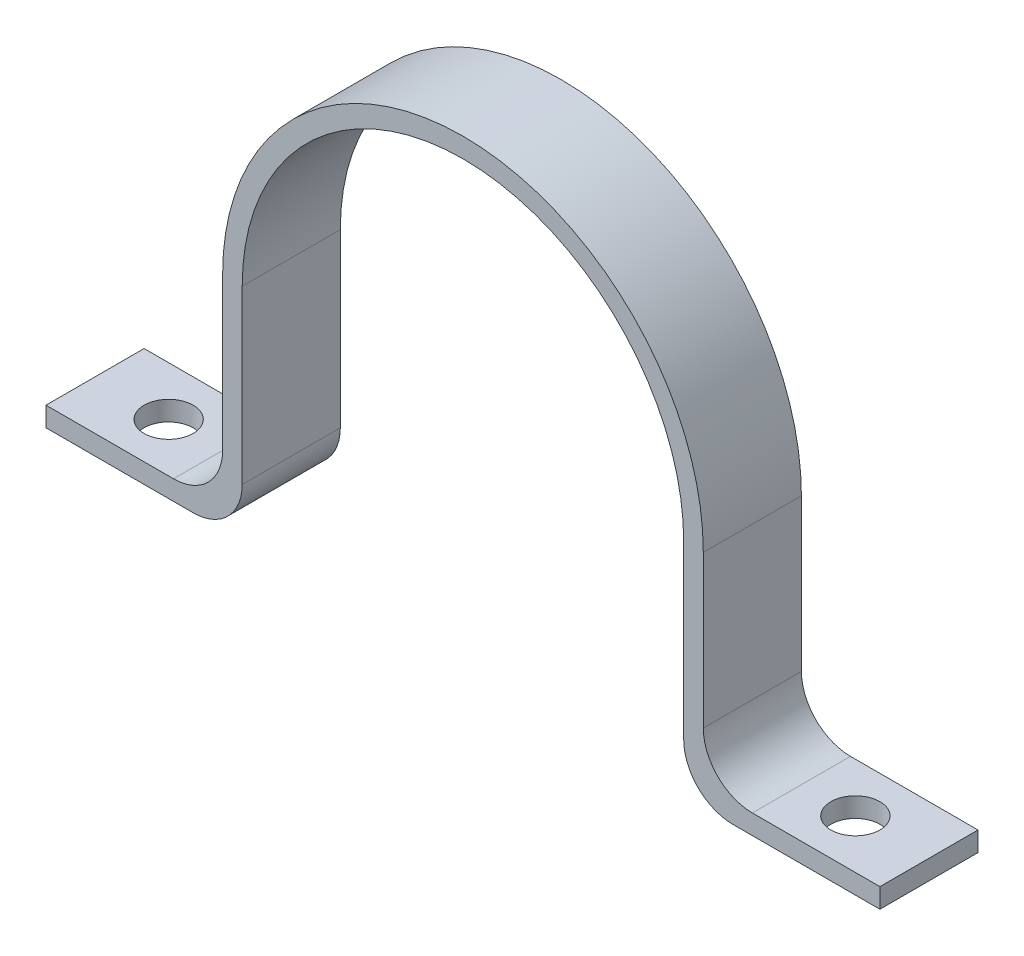
ISO-10303-21;
HEADER;
FILE_DESCRIPTION(('STEP AP214'),'2;1');
FILE_NAME('part.step','',(''),(''),'','','');
FILE_SCHEMA(('AUTOMOTIVE_DESIGN { 1 0 10303 214 1 1 1 1 }'));
ENDSEC;
DATA;
#1=APPLICATION_CONTEXT('core data for automotive mechanical design processes');
#2=APPLICATION_PROTOCOL_DEFINITION('international standard','automotive_design',2000,#1);
#3=PRODUCT_CONTEXT('',#1,'mechanical');
#4=PRODUCT('Part','Part','',(#3));
#5=PRODUCT_RELATED_PRODUCT_CATEGORY('part','',(#4));
#6=PRODUCT_DEFINITION_FORMATION('','',#4);
#7=PRODUCT_DEFINITION_CONTEXT('part definition',#1,'design');
#8=PRODUCT_DEFINITION('design','',#6,#7);
#9=PRODUCT_DEFINITION_SHAPE('','',#8);
#10=(LENGTH_UNIT() NAMED_UNIT(*) SI_UNIT(.MILLI.,.METRE.));
#11=(NAMED_UNIT(*) PLANE_ANGLE_UNIT() SI_UNIT($,.RADIAN.));
#12=(NAMED_UNIT(*) SI_UNIT($,.STERADIAN.) SOLID_ANGLE_UNIT());
#13=UNCERTAINTY_MEASURE_WITH_UNIT(LENGTH_MEASURE(1.E-05),#10,'distance_accuracy_value','');
#14=(GEOMETRIC_REPRESENTATION_CONTEXT(3) GLOBAL_UNCERTAINTY_ASSIGNED_CONTEXT((#13)) GLOBAL_UNIT_ASSIGNED_CONTEXT((#10,
#11,#12)) REPRESENTATION_CONTEXT('',''));
#15=CARTESIAN_POINT('',(0.,0.,0.));
#16=DIRECTION('',(0.,0.,1.));
#17=DIRECTION('',(1.,0.,0.));
#18=AXIS2_PLACEMENT_3D('',#15,#16,#17);
#19=CARTESIAN_POINT('',(24.5,0.,10.));
#20=DIRECTION('',(-1.,0.,0.));
#21=DIRECTION('',(0.,-1.,0.));
#22=AXIS2_PLACEMENT_3D('',#19,#20,#21);
#23=PLANE('',#22);
#24=DIRECTION('',(0.,1.,0.));
#25=VECTOR('',#24,1.);
#26=CARTESIAN_POINT('',(24.5,0.,10.));
#27=LINE('',#26,#25);
#28=CARTESIAN_POINT('',(24.5,-15.5,10.));
#29=VERTEX_POINT('',#28);
#30=CARTESIAN_POINT('',(24.5,0.,10.));
#31=VERTEX_POINT('',#30);
#32=EDGE_CURVE('E199',#29,#31,#27,.T.);
#33=ORIENTED_EDGE('',*,*,#32,.F.);
#34=DIRECTION('',(0.,0.,-1.));
#35=VECTOR('',#34,1.);
#36=CARTESIAN_POINT('',(24.5,-15.5,0.));
#37=LINE('',#36,#35);
#38=CARTESIAN_POINT('',(24.5,-15.5,0.));
#39=VERTEX_POINT('',#38);
#40=EDGE_CURVE('E265',#29,#39,#37,.T.);
#41=ORIENTED_EDGE('',*,*,#40,.T.);
#42=DIRECTION('',(0.,1.,0.));
#43=VECTOR('',#42,1.);
#44=CARTESIAN_POINT('',(24.5,0.,0.));
#45=LINE('',#44,#43);
#46=CARTESIAN_POINT('',(24.5,0.,0.));
#47=VERTEX_POINT('',#46);
#48=EDGE_CURVE('E198',#39,#47,#45,.T.);
#49=ORIENTED_EDGE('',*,*,#48,.T.);
#50=DIRECTION('',(0.,0.,-1.));
#51=VECTOR('',#50,1.);
#52=CARTESIAN_POINT('',(24.5,0.,10.));
#53=LINE('',#52,#51);
#54=EDGE_CURVE('E246',#31,#47,#53,.T.);
#55=ORIENTED_EDGE('',*,*,#54,.F.);
#56=EDGE_LOOP('',(#33,#41,#49,#55));
#57=FACE_BOUND('',#56,.T.);
#58=ADVANCED_FACE('F34',(#57),#23,.F.);
#59=CARTESIAN_POINT('',(0.,0.,10.));
#60=DIRECTION('',(0.,0.,-1.));
#61=DIRECTION('',(-1.,0.,0.));
#62=AXIS2_PLACEMENT_3D('',#59,#60,#61);
#63=CYLINDRICAL_SURFACE('',#62,24.5);
#64=CARTESIAN_POINT('',(0.,0.,0.));
#65=DIRECTION('',(0.,0.,1.));
#66=DIRECTION('',(1.,0.,0.));
#67=AXIS2_PLACEMENT_3D('',#64,#65,#66);
#68=CIRCLE('',#67,24.5);
#69=CARTESIAN_POINT('',(-24.5,0.,0.));
#70=VERTEX_POINT('',#69);
#71=EDGE_CURVE('E219',#47,#70,#68,.T.);
#72=ORIENTED_EDGE('',*,*,#71,.T.);
#73=DIRECTION('',(0.,0.,-1.));
#74=VECTOR('',#73,1.);
#75=CARTESIAN_POINT('',(-24.5,0.,10.));
#76=LINE('',#75,#74);
#77=CARTESIAN_POINT('',(-24.5,0.,10.));
#78=VERTEX_POINT('',#77);
#79=EDGE_CURVE('E243',#78,#70,#76,.T.);
#80=ORIENTED_EDGE('',*,*,#79,.F.);
#81=CARTESIAN_POINT('',(0.,0.,10.));
#82=DIRECTION('',(0.,0.,1.));
#83=DIRECTION('',(1.,0.,0.));
#84=AXIS2_PLACEMENT_3D('',#81,#82,#83);
#85=CIRCLE('',#84,24.5);
#86=EDGE_CURVE('E201',#31,#78,#85,.T.);
#87=ORIENTED_EDGE('',*,*,#86,.F.);
#88=ORIENTED_EDGE('',*,*,#54,.T.);
#89=EDGE_LOOP('',(#72,#80,#87,#88));
#90=FACE_BOUND('',#89,.T.);
#91=ADVANCED_FACE('F295',(#90),#63,.T.);
#92=CARTESIAN_POINT('',(-24.5,0.,10.));
#93=DIRECTION('',(1.,0.,0.));
#94=DIRECTION('',(0.,0.,-1.));
#95=AXIS2_PLACEMENT_3D('',#92,#93,#94);
#96=PLANE('',#95);
#97=DIRECTION('',(0.,-1.,0.));
#98=VECTOR('',#97,1.);
#99=CARTESIAN_POINT('',(-24.5,0.,0.));
#100=LINE('',#99,#98);
#101=CARTESIAN_POINT('',(-24.5,-15.5,0.));
#102=VERTEX_POINT('',#101);
#103=EDGE_CURVE('E221',#70,#102,#100,.T.);
#104=ORIENTED_EDGE('',*,*,#103,.T.);
#105=DIRECTION('',(0.,0.,-1.));
#106=VECTOR('',#105,1.);
#107=CARTESIAN_POINT('',(-24.5,-15.5,10.));
#108=LINE('',#107,#106);
#109=CARTESIAN_POINT('',(-24.5,-15.5,10.));
#110=VERTEX_POINT('',#109);
#111=EDGE_CURVE('E260',#102,#110,#108,.F.);
#112=ORIENTED_EDGE('',*,*,#111,.T.);
#113=DIRECTION('',(0.,-1.,0.));
#114=VECTOR('',#113,1.);
#115=CARTESIAN_POINT('',(-24.5,0.,10.));
#116=LINE('',#115,#114);
#117=EDGE_CURVE('E162',#78,#110,#116,.T.);
#118=ORIENTED_EDGE('',*,*,#117,.F.);
#119=ORIENTED_EDGE('',*,*,#79,.T.);
#120=EDGE_LOOP('',(#104,#112,#118,#119));
#121=FACE_BOUND('',#120,.T.);
#122=ADVANCED_FACE('F344',(#121),#96,.F.);
#123=CARTESIAN_POINT('',(-32.5,-20.5,10.));
#124=DIRECTION('',(0.,-1.,0.));
#125=DIRECTION('',(1.,0.,0.));
#126=AXIS2_PLACEMENT_3D('',#123,#124,#125);
#127=PLANE('',#126);
#128=CARTESIAN_POINT('',(-35.,-20.5,5.));
#129=DIRECTION('',(0.,1.,0.));
#130=DIRECTION('',(-1.,0.,0.));
#131=AXIS2_PLACEMENT_3D('',#128,#129,#130);
#132=CIRCLE('',#131,2.49999999999999);
#133=CARTESIAN_POINT('',(-37.5,-20.5,5.));
#134=VERTEX_POINT('',#133);
#135=EDGE_CURVE('E180',#134,#134,#132,.T.);
#136=ORIENTED_EDGE('',*,*,#135,.F.);
#137=EDGE_LOOP('',(#136));
#138=FACE_BOUND('',#137,.T.);
#139=DIRECTION('',(-1.,0.,0.));
#140=VECTOR('',#139,1.);
#141=CARTESIAN_POINT('',(-32.5,-20.5,10.));
#142=LINE('',#141,#140);
#143=CARTESIAN_POINT('',(-29.5,-20.5,10.));
#144=VERTEX_POINT('',#143);
#145=CARTESIAN_POINT('',(-42.5,-20.5,10.));
#146=VERTEX_POINT('',#145);
#147=EDGE_CURVE('E149',#144,#146,#142,.T.);
#148=ORIENTED_EDGE('',*,*,#147,.F.);
#149=DIRECTION('',(0.,0.,-1.));
#150=VECTOR('',#149,1.);
#151=CARTESIAN_POINT('',(-29.5,-20.5,0.));
#152=LINE('',#151,#150);
#153=CARTESIAN_POINT('',(-29.5,-20.5,0.));
#154=VERTEX_POINT('',#153);
#155=EDGE_CURVE('E258',#144,#154,#152,.T.);
#156=ORIENTED_EDGE('',*,*,#155,.T.);
#157=DIRECTION('',(-1.,0.,0.));
#158=VECTOR('',#157,1.);
#159=CARTESIAN_POINT('',(-32.5,-20.5,0.));
#160=LINE('',#159,#158);
#161=CARTESIAN_POINT('',(-42.5,-20.5,0.));
#162=VERTEX_POINT('',#161);
#163=EDGE_CURVE('E168',#154,#162,#160,.T.);
#164=ORIENTED_EDGE('',*,*,#163,.T.);
#165=DIRECTION('',(0.,0.,-1.));
#166=VECTOR('',#165,1.);
#167=CARTESIAN_POINT('',(-42.5,-20.5,10.));
#168=LINE('',#167,#166);
#169=EDGE_CURVE('E165',#146,#162,#168,.T.);
#170=ORIENTED_EDGE('',*,*,#169,.F.);
#171=EDGE_LOOP('',(#148,#156,#164,#170));
#172=FACE_BOUND('',#171,.T.);
#173=ADVANCED_FACE('F166',(#138,#172),#127,.F.);
#174=CARTESIAN_POINT('',(-22.5,-22.5,10.));
#175=DIRECTION('',(0.,1.,0.));
#176=DIRECTION('',(-1.,0.,0.));
#177=AXIS2_PLACEMENT_3D('',#174,#175,#176);
#178=PLANE('',#177);
#179=CARTESIAN_POINT('',(-35.,-22.5,5.));
#180=DIRECTION('',(0.,1.,0.));
#181=DIRECTION('',(-1.,0.,0.));
#182=AXIS2_PLACEMENT_3D('',#179,#180,#181);
#183=CIRCLE('',#182,2.49999999999999);
#184=CARTESIAN_POINT('',(-37.5,-22.5,5.));
#185=VERTEX_POINT('',#184);
#186=EDGE_CURVE('E38',#185,#185,#183,.T.);
#187=ORIENTED_EDGE('',*,*,#186,.T.);
#188=EDGE_LOOP('',(#187));
#189=FACE_BOUND('',#188,.T.);
#190=DIRECTION('',(1.,0.,0.));
#191=VECTOR('',#190,1.);
#192=CARTESIAN_POINT('',(-22.5,-22.5,0.));
#193=LINE('',#192,#191);
#194=CARTESIAN_POINT('',(-42.5,-22.5,0.));
#195=VERTEX_POINT('',#194);
#196=CARTESIAN_POINT('',(-27.5,-22.5,0.));
#197=VERTEX_POINT('',#196);
#198=EDGE_CURVE('E225',#195,#197,#193,.T.);
#199=ORIENTED_EDGE('',*,*,#198,.T.);
#200=DIRECTION('',(0.,0.,-1.));
#201=VECTOR('',#200,1.);
#202=CARTESIAN_POINT('',(-27.5,-22.5,10.));
#203=LINE('',#202,#201);
#204=CARTESIAN_POINT('',(-27.5,-22.5,10.));
#205=VERTEX_POINT('',#204);
#206=EDGE_CURVE('E254',#197,#205,#203,.F.);
#207=ORIENTED_EDGE('',*,*,#206,.T.);
#208=DIRECTION('',(1.,0.,0.));
#209=VECTOR('',#208,1.);
#210=CARTESIAN_POINT('',(-22.5,-22.5,10.));
#211=LINE('',#210,#209);
#212=CARTESIAN_POINT('',(-42.5,-22.5,10.));
#213=VERTEX_POINT('',#212);
#214=EDGE_CURVE('E161',#213,#205,#211,.T.);
#215=ORIENTED_EDGE('',*,*,#214,.F.);
#216=DIRECTION('',(0.,0.,1.));
#217=VECTOR('',#216,1.);
#218=CARTESIAN_POINT('',(-42.5,-22.5,10.));
#219=LINE('',#218,#217);
#220=EDGE_CURVE('E177',#195,#213,#219,.T.);
#221=ORIENTED_EDGE('',*,*,#220,.F.);
#222=EDGE_LOOP('',(#199,#207,#215,#221));
#223=FACE_BOUND('',#222,.T.);
#224=ADVANCED_FACE('F304',(#189,#223),#178,.F.);
#225=CARTESIAN_POINT('',(-22.5,0.,10.));
#226=DIRECTION('',(-1.,0.,0.));
#227=DIRECTION('',(0.,-1.,0.));
#228=AXIS2_PLACEMENT_3D('',#225,#226,#227);
#229=PLANE('',#228);
#230=DIRECTION('',(0.,1.,0.));
#231=VECTOR('',#230,1.);
#232=CARTESIAN_POINT('',(-22.5,0.,10.));
#233=LINE('',#232,#231);
#234=CARTESIAN_POINT('',(-22.5,-17.5,10.));
#235=VERTEX_POINT('',#234);
#236=CARTESIAN_POINT('',(-22.5,0.,10.));
#237=VERTEX_POINT('',#236);
#238=EDGE_CURVE('E206',#235,#237,#233,.T.);
#239=ORIENTED_EDGE('',*,*,#238,.F.);
#240=DIRECTION('',(0.,0.,-1.));
#241=VECTOR('',#240,1.);
#242=CARTESIAN_POINT('',(-22.5,-17.5,10.));
#243=LINE('',#242,#241);
#244=CARTESIAN_POINT('',(-22.5,-17.5,0.));
#245=VERTEX_POINT('',#244);
#246=EDGE_CURVE('E249',#235,#245,#243,.T.);
#247=ORIENTED_EDGE('',*,*,#246,.T.);
#248=DIRECTION('',(0.,1.,0.));
#249=VECTOR('',#248,1.);
#250=CARTESIAN_POINT('',(-22.5,0.,0.));
#251=LINE('',#250,#249);
#252=CARTESIAN_POINT('',(-22.5,0.,0.));
#253=VERTEX_POINT('',#252);
#254=EDGE_CURVE('E228',#245,#253,#251,.T.);
#255=ORIENTED_EDGE('',*,*,#254,.T.);
#256=DIRECTION('',(0.,0.,-1.));
#257=VECTOR('',#256,1.);
#258=CARTESIAN_POINT('',(-22.5,0.,10.));
#259=LINE('',#258,#257);
#260=EDGE_CURVE('E240',#237,#253,#259,.T.);
#261=ORIENTED_EDGE('',*,*,#260,.F.);
#262=EDGE_LOOP('',(#239,#247,#255,#261));
#263=FACE_BOUND('',#262,.T.);
#264=ADVANCED_FACE('F313',(#263),#229,.F.);
#265=CARTESIAN_POINT('',(0.,0.,10.));
#266=DIRECTION('',(0.,0.,-1.));
#267=DIRECTION('',(-1.,0.,0.));
#268=AXIS2_PLACEMENT_3D('',#265,#266,#267);
#269=CYLINDRICAL_SURFACE('',#268,22.5);
#270=CARTESIAN_POINT('',(0.,0.,0.));
#271=DIRECTION('',(0.,0.,-1.));
#272=DIRECTION('',(1.,0.,0.));
#273=AXIS2_PLACEMENT_3D('',#270,#271,#272);
#274=CIRCLE('',#273,22.5);
#275=CARTESIAN_POINT('',(22.5,0.,0.));
#276=VERTEX_POINT('',#275);
#277=EDGE_CURVE('E230',#253,#276,#274,.T.);
#278=ORIENTED_EDGE('',*,*,#277,.T.);
#279=DIRECTION('',(0.,0.,-1.));
#280=VECTOR('',#279,1.);
#281=CARTESIAN_POINT('',(22.5,0.,10.));
#282=LINE('',#281,#280);
#283=CARTESIAN_POINT('',(22.5,0.,10.));
#284=VERTEX_POINT('',#283);
#285=EDGE_CURVE('E217',#284,#276,#282,.T.);
#286=ORIENTED_EDGE('',*,*,#285,.F.);
#287=CARTESIAN_POINT('',(0.,0.,10.));
#288=DIRECTION('',(0.,0.,-1.));
#289=DIRECTION('',(1.,0.,0.));
#290=AXIS2_PLACEMENT_3D('',#287,#288,#289);
#291=CIRCLE('',#290,22.5);
#292=EDGE_CURVE('E208',#237,#284,#291,.T.);
#293=ORIENTED_EDGE('',*,*,#292,.F.);
#294=ORIENTED_EDGE('',*,*,#260,.T.);
#295=EDGE_LOOP('',(#278,#286,#293,#294));
#296=FACE_BOUND('',#295,.T.);
#297=ADVANCED_FACE('F318',(#296),#269,.F.);
#298=CARTESIAN_POINT('',(22.5,0.,10.));
#299=DIRECTION('',(1.,0.,0.));
#300=DIRECTION('',(0.,1.,0.));
#301=AXIS2_PLACEMENT_3D('',#298,#299,#300);
#302=PLANE('',#301);
#303=DIRECTION('',(0.,-1.,0.));
#304=VECTOR('',#303,1.);
#305=CARTESIAN_POINT('',(22.5,0.,0.));
#306=LINE('',#305,#304);
#307=CARTESIAN_POINT('',(22.5,-17.5,0.));
#308=VERTEX_POINT('',#307);
#309=EDGE_CURVE('E232',#276,#308,#306,.T.);
#310=ORIENTED_EDGE('',*,*,#309,.T.);
#311=DIRECTION('',(0.,0.,-1.));
#312=VECTOR('',#311,1.);
#313=CARTESIAN_POINT('',(22.5,-17.5,10.));
#314=LINE('',#313,#312);
#315=CARTESIAN_POINT('',(22.5,-17.5,10.));
#316=VERTEX_POINT('',#315);
#317=EDGE_CURVE('E50',#308,#316,#314,.F.);
#318=ORIENTED_EDGE('',*,*,#317,.T.);
#319=DIRECTION('',(0.,-1.,0.));
#320=VECTOR('',#319,1.);
#321=CARTESIAN_POINT('',(22.5,0.,10.));
#322=LINE('',#321,#320);
#323=EDGE_CURVE('E210',#284,#316,#322,.T.);
#324=ORIENTED_EDGE('',*,*,#323,.F.);
#325=ORIENTED_EDGE('',*,*,#285,.T.);
#326=EDGE_LOOP('',(#310,#318,#324,#325));
#327=FACE_BOUND('',#326,.T.);
#328=ADVANCED_FACE('F320',(#327),#302,.F.);
#329=CARTESIAN_POINT('',(22.5,-22.5,10.));
#330=DIRECTION('',(0.,1.,0.));
#331=DIRECTION('',(0.,0.,1.));
#332=AXIS2_PLACEMENT_3D('',#329,#330,#331);
#333=PLANE('',#332);
#334=CARTESIAN_POINT('',(35.,-22.5,5.));
#335=DIRECTION('',(0.,1.,0.));
#336=DIRECTION('',(0.,0.,1.));
#337=AXIS2_PLACEMENT_3D('',#334,#335,#336);
#338=CIRCLE('',#337,2.49999999999999);
#339=CARTESIAN_POINT('',(35.,-22.5,7.49999999999999));
#340=VERTEX_POINT('',#339);
#341=EDGE_CURVE('E460',#340,#340,#338,.F.);
#342=ORIENTED_EDGE('',*,*,#341,.F.);
#343=EDGE_LOOP('',(#342));
#344=FACE_BOUND('',#343,.T.);
#345=DIRECTION('',(1.,0.,0.));
#346=VECTOR('',#345,1.);
#347=CARTESIAN_POINT('',(22.5,-22.5,10.));
#348=LINE('',#347,#346);
#349=CARTESIAN_POINT('',(27.5,-22.5,10.));
#350=VERTEX_POINT('',#349);
#351=CARTESIAN_POINT('',(42.5000000000001,-22.5,10.));
#352=VERTEX_POINT('',#351);
#353=EDGE_CURVE('E212',#350,#352,#348,.T.);
#354=ORIENTED_EDGE('',*,*,#353,.F.);
#355=DIRECTION('',(0.,0.,-1.));
#356=VECTOR('',#355,1.);
#357=CARTESIAN_POINT('',(27.5,-22.5,10.));
#358=LINE('',#357,#356);
#359=CARTESIAN_POINT('',(27.5,-22.5,0.));
#360=VERTEX_POINT('',#359);
#361=EDGE_CURVE('E270',#350,#360,#358,.T.);
#362=ORIENTED_EDGE('',*,*,#361,.T.);
#363=DIRECTION('',(1.,0.,0.));
#364=VECTOR('',#363,1.);
#365=CARTESIAN_POINT('',(22.5,-22.5,0.));
#366=LINE('',#365,#364);
#367=CARTESIAN_POINT('',(42.5000000000001,-22.5,0.));
#368=VERTEX_POINT('',#367);
#369=EDGE_CURVE('E234',#360,#368,#366,.T.);
#370=ORIENTED_EDGE('',*,*,#369,.T.);
#371=DIRECTION('',(0.,0.,-1.));
#372=VECTOR('',#371,1.);
#373=CARTESIAN_POINT('',(42.5000000000001,-22.5,10.));
#374=LINE('',#373,#372);
#375=EDGE_CURVE('E189',#352,#368,#374,.T.);
#376=ORIENTED_EDGE('',*,*,#375,.F.);
#377=EDGE_LOOP('',(#354,#362,#370,#376));
#378=FACE_BOUND('',#377,.T.);
#379=ADVANCED_FACE('F326',(#344,#378),#333,.F.);
#380=CARTESIAN_POINT('',(24.5,-20.5,10.));
#381=DIRECTION('',(0.,-1.,0.));
#382=DIRECTION('',(0.,0.,-1.));
#383=AXIS2_PLACEMENT_3D('',#380,#381,#382);
#384=PLANE('',#383);
#385=CARTESIAN_POINT('',(35.,-20.5,5.));
#386=DIRECTION('',(0.,-1.,0.));
#387=DIRECTION('',(1.,0.,0.));
#388=AXIS2_PLACEMENT_3D('',#385,#386,#387);
#389=CIRCLE('',#388,2.49999999999999);
#390=CARTESIAN_POINT('',(37.5,-20.5,5.));
#391=VERTEX_POINT('',#390);
#392=EDGE_CURVE('E457',#391,#391,#389,.T.);
#393=ORIENTED_EDGE('',*,*,#392,.T.);
#394=EDGE_LOOP('',(#393));
#395=FACE_BOUND('',#394,.T.);
#396=DIRECTION('',(-1.,0.,0.));
#397=VECTOR('',#396,1.);
#398=CARTESIAN_POINT('',(24.5,-20.5,0.));
#399=LINE('',#398,#397);
#400=CARTESIAN_POINT('',(42.5000000000001,-20.5,0.));
#401=VERTEX_POINT('',#400);
#402=CARTESIAN_POINT('',(29.5,-20.5,0.));
#403=VERTEX_POINT('',#402);
#404=EDGE_CURVE('E202',#401,#403,#399,.T.);
#405=ORIENTED_EDGE('',*,*,#404,.T.);
#406=DIRECTION('',(0.,0.,-1.));
#407=VECTOR('',#406,1.);
#408=CARTESIAN_POINT('',(29.5,-20.5,10.));
#409=LINE('',#408,#407);
#410=CARTESIAN_POINT('',(29.5,-20.5,10.));
#411=VERTEX_POINT('',#410);
#412=EDGE_CURVE('E268',#403,#411,#409,.F.);
#413=ORIENTED_EDGE('',*,*,#412,.T.);
#414=DIRECTION('',(-1.,0.,0.));
#415=VECTOR('',#414,1.);
#416=CARTESIAN_POINT('',(24.5,-20.5,10.));
#417=LINE('',#416,#415);
#418=CARTESIAN_POINT('',(42.5000000000001,-20.5,10.));
#419=VERTEX_POINT('',#418);
#420=EDGE_CURVE('E214',#419,#411,#417,.T.);
#421=ORIENTED_EDGE('',*,*,#420,.F.);
#422=DIRECTION('',(0.,0.,1.));
#423=VECTOR('',#422,1.);
#424=CARTESIAN_POINT('',(42.5000000000001,-20.5,10.));
#425=LINE('',#424,#423);
#426=EDGE_CURVE('E195',#401,#419,#425,.T.);
#427=ORIENTED_EDGE('',*,*,#426,.F.);
#428=EDGE_LOOP('',(#405,#413,#421,#427));
#429=FACE_BOUND('',#428,.T.);
#430=ADVANCED_FACE('F286',(#395,#429),#384,.F.);
#431=CARTESIAN_POINT('',(0.,0.,10.));
#432=DIRECTION('',(0.,0.,1.));
#433=DIRECTION('',(1.,0.,0.));
#434=AXIS2_PLACEMENT_3D('',#431,#432,#433);
#435=PLANE('',#434);
#436=ORIENTED_EDGE('',*,*,#323,.T.);
#437=CARTESIAN_POINT('',(27.5,-17.5,10.));
#438=DIRECTION('',(0.,0.,1.));
#439=DIRECTION('',(1.,0.,0.));
#440=AXIS2_PLACEMENT_3D('',#437,#438,#439);
#441=CIRCLE('',#440,5.);
#442=EDGE_CURVE('E275',#316,#350,#441,.T.);
#443=ORIENTED_EDGE('',*,*,#442,.T.);
#444=ORIENTED_EDGE('',*,*,#353,.T.);
#445=DIRECTION('',(0.,-1.,0.));
#446=VECTOR('',#445,1.);
#447=CARTESIAN_POINT('',(42.5000000000001,-20.5,10.));
#448=LINE('',#447,#446);
#449=EDGE_CURVE('E186',#419,#352,#448,.T.);
#450=ORIENTED_EDGE('',*,*,#449,.F.);
#451=ORIENTED_EDGE('',*,*,#420,.T.);
#452=CARTESIAN_POINT('',(29.5,-15.5,10.));
#453=DIRECTION('',(0.,0.,1.));
#454=DIRECTION('',(1.,0.,0.));
#455=AXIS2_PLACEMENT_3D('',#452,#453,#454);
#456=CIRCLE('',#455,5.);
#457=EDGE_CURVE('E11',#411,#29,#456,.F.);
#458=ORIENTED_EDGE('',*,*,#457,.T.);
#459=ORIENTED_EDGE('',*,*,#32,.T.);
#460=ORIENTED_EDGE('',*,*,#86,.T.);
#461=ORIENTED_EDGE('',*,*,#117,.T.);
#462=CARTESIAN_POINT('',(-29.5,-15.5,10.));
#463=DIRECTION('',(0.,0.,1.));
#464=DIRECTION('',(1.,0.,0.));
#465=AXIS2_PLACEMENT_3D('',#462,#463,#464);
#466=CIRCLE('',#465,5.);
#467=EDGE_CURVE('E157',#110,#144,#466,.F.);
#468=ORIENTED_EDGE('',*,*,#467,.T.);
#469=ORIENTED_EDGE('',*,*,#147,.T.);
#470=DIRECTION('',(0.,1.,0.));
#471=VECTOR('',#470,1.);
#472=CARTESIAN_POINT('',(-42.5,-20.5,10.));
#473=LINE('',#472,#471);
#474=EDGE_CURVE('E154',#213,#146,#473,.T.);
#475=ORIENTED_EDGE('',*,*,#474,.F.);
#476=ORIENTED_EDGE('',*,*,#214,.T.);
#477=CARTESIAN_POINT('',(-27.5,-17.5,10.));
#478=DIRECTION('',(0.,0.,1.));
#479=DIRECTION('',(1.,0.,0.));
#480=AXIS2_PLACEMENT_3D('',#477,#478,#479);
#481=CIRCLE('',#480,5.);
#482=EDGE_CURVE('E256',#205,#235,#481,.T.);
#483=ORIENTED_EDGE('',*,*,#482,.T.);
#484=ORIENTED_EDGE('',*,*,#238,.T.);
#485=ORIENTED_EDGE('',*,*,#292,.T.);
#486=EDGE_LOOP('',(#436,#443,#444,#450,#451,#458,#459,#460,#461,#468,#469,#475,#476,#483,#484,#485));
#487=FACE_BOUND('',#486,.T.);
#488=ADVANCED_FACE('F151',(#487),#435,.T.);
#489=CARTESIAN_POINT('',(0.,0.,0.));
#490=DIRECTION('',(0.,0.,1.));
#491=DIRECTION('',(1.,0.,0.));
#492=AXIS2_PLACEMENT_3D('',#489,#490,#491);
#493=PLANE('',#492);
#494=ORIENTED_EDGE('',*,*,#369,.F.);
#495=CARTESIAN_POINT('',(27.5,-17.5,0.));
#496=DIRECTION('',(0.,0.,1.));
#497=DIRECTION('',(1.,0.,0.));
#498=AXIS2_PLACEMENT_3D('',#495,#496,#497);
#499=CIRCLE('',#498,5.);
#500=EDGE_CURVE('E58',#360,#308,#499,.F.);
#501=ORIENTED_EDGE('',*,*,#500,.T.);
#502=ORIENTED_EDGE('',*,*,#309,.F.);
#503=ORIENTED_EDGE('',*,*,#277,.F.);
#504=ORIENTED_EDGE('',*,*,#254,.F.);
#505=CARTESIAN_POINT('',(-27.5,-17.5,0.));
#506=DIRECTION('',(0.,0.,1.));
#507=DIRECTION('',(1.,0.,0.));
#508=AXIS2_PLACEMENT_3D('',#505,#506,#507);
#509=CIRCLE('',#508,5.);
#510=EDGE_CURVE('E252',#245,#197,#509,.F.);
#511=ORIENTED_EDGE('',*,*,#510,.T.);
#512=ORIENTED_EDGE('',*,*,#198,.F.);
#513=DIRECTION('',(0.,-1.,0.));
#514=VECTOR('',#513,1.);
#515=CARTESIAN_POINT('',(-42.5,-20.5,0.));
#516=LINE('',#515,#514);
#517=EDGE_CURVE('E172',#162,#195,#516,.T.);
#518=ORIENTED_EDGE('',*,*,#517,.F.);
#519=ORIENTED_EDGE('',*,*,#163,.F.);
#520=CARTESIAN_POINT('',(-29.5,-15.5,0.));
#521=DIRECTION('',(0.,0.,1.));
#522=DIRECTION('',(1.,0.,0.));
#523=AXIS2_PLACEMENT_3D('',#520,#521,#522);
#524=CIRCLE('',#523,5.);
#525=EDGE_CURVE('E262',#154,#102,#524,.T.);
#526=ORIENTED_EDGE('',*,*,#525,.T.);
#527=ORIENTED_EDGE('',*,*,#103,.F.);
#528=ORIENTED_EDGE('',*,*,#71,.F.);
#529=ORIENTED_EDGE('',*,*,#48,.F.);
#530=CARTESIAN_POINT('',(29.5,-15.5,0.));
#531=DIRECTION('',(0.,0.,1.));
#532=DIRECTION('',(1.,0.,0.));
#533=AXIS2_PLACEMENT_3D('',#530,#531,#532);
#534=CIRCLE('',#533,5.);
#535=EDGE_CURVE('E43',#39,#403,#534,.T.);
#536=ORIENTED_EDGE('',*,*,#535,.T.);
#537=ORIENTED_EDGE('',*,*,#404,.F.);
#538=DIRECTION('',(0.,1.,0.));
#539=VECTOR('',#538,1.);
#540=CARTESIAN_POINT('',(42.5000000000001,-20.5,0.));
#541=LINE('',#540,#539);
#542=EDGE_CURVE('E192',#368,#401,#541,.T.);
#543=ORIENTED_EDGE('',*,*,#542,.F.);
#544=EDGE_LOOP('',(#494,#501,#502,#503,#504,#511,#512,#518,#519,#526,#527,#528,#529,#536,#537,#543));
#545=FACE_BOUND('',#544,.T.);
#546=ADVANCED_FACE('F278',(#545),#493,.F.);
#547=CARTESIAN_POINT('',(-27.5,-17.5,10.));
#548=DIRECTION('',(0.,0.,-1.));
#549=DIRECTION('',(-1.,0.,0.));
#550=AXIS2_PLACEMENT_3D('',#547,#548,#549);
#551=CYLINDRICAL_SURFACE('',#550,5.);
#552=ORIENTED_EDGE('',*,*,#482,.F.);
#553=ORIENTED_EDGE('',*,*,#206,.F.);
#554=ORIENTED_EDGE('',*,*,#510,.F.);
#555=ORIENTED_EDGE('',*,*,#246,.F.);
#556=EDGE_LOOP('',(#552,#553,#554,#555));
#557=FACE_BOUND('',#556,.T.);
#558=ADVANCED_FACE('F310',(#557),#551,.T.);
#559=CARTESIAN_POINT('',(-29.5,-15.5,10.));
#560=DIRECTION('',(0.,0.,1.));
#561=DIRECTION('',(1.,0.,0.));
#562=AXIS2_PLACEMENT_3D('',#559,#560,#561);
#563=CYLINDRICAL_SURFACE('',#562,5.);
#564=ORIENTED_EDGE('',*,*,#467,.F.);
#565=ORIENTED_EDGE('',*,*,#111,.F.);
#566=ORIENTED_EDGE('',*,*,#525,.F.);
#567=ORIENTED_EDGE('',*,*,#155,.F.);
#568=EDGE_LOOP('',(#564,#565,#566,#567));
#569=FACE_BOUND('',#568,.T.);
#570=ADVANCED_FACE('F301',(#569),#563,.F.);
#571=CARTESIAN_POINT('',(29.5,-15.5,10.));
#572=DIRECTION('',(0.,0.,1.));
#573=DIRECTION('',(1.,0.,0.));
#574=AXIS2_PLACEMENT_3D('',#571,#572,#573);
#575=CYLINDRICAL_SURFACE('',#574,5.);
#576=ORIENTED_EDGE('',*,*,#457,.F.);
#577=ORIENTED_EDGE('',*,*,#412,.F.);
#578=ORIENTED_EDGE('',*,*,#535,.F.);
#579=ORIENTED_EDGE('',*,*,#40,.F.);
#580=EDGE_LOOP('',(#576,#577,#578,#579));
#581=FACE_BOUND('',#580,.T.);
#582=ADVANCED_FACE('F288',(#581),#575,.F.);
#583=CARTESIAN_POINT('',(27.5,-17.5,10.));
#584=DIRECTION('',(0.,0.,-1.));
#585=DIRECTION('',(-1.,0.,0.));
#586=AXIS2_PLACEMENT_3D('',#583,#584,#585);
#587=CYLINDRICAL_SURFACE('',#586,5.);
#588=ORIENTED_EDGE('',*,*,#442,.F.);
#589=ORIENTED_EDGE('',*,*,#317,.F.);
#590=ORIENTED_EDGE('',*,*,#500,.F.);
#591=ORIENTED_EDGE('',*,*,#361,.F.);
#592=EDGE_LOOP('',(#588,#589,#590,#591));
#593=FACE_BOUND('',#592,.T.);
#594=ADVANCED_FACE('F36',(#593),#587,.T.);
#595=CARTESIAN_POINT('',(42.5000000000001,0.,0.));
#596=DIRECTION('',(1.,0.,0.));
#597=DIRECTION('',(0.,0.,-1.));
#598=AXIS2_PLACEMENT_3D('',#595,#596,#597);
#599=PLANE('',#598);
#600=ORIENTED_EDGE('',*,*,#449,.T.);
#601=ORIENTED_EDGE('',*,*,#375,.T.);
#602=ORIENTED_EDGE('',*,*,#542,.T.);
#603=ORIENTED_EDGE('',*,*,#426,.T.);
#604=EDGE_LOOP('',(#600,#601,#602,#603));
#605=FACE_BOUND('',#604,.T.);
#606=ADVANCED_FACE('F329',(#605),#599,.T.);
#607=CARTESIAN_POINT('',(-42.5,0.,0.));
#608=DIRECTION('',(1.,0.,0.));
#609=DIRECTION('',(0.,0.,-1.));
#610=AXIS2_PLACEMENT_3D('',#607,#608,#609);
#611=PLANE('',#610);
#612=ORIENTED_EDGE('',*,*,#474,.T.);
#613=ORIENTED_EDGE('',*,*,#169,.T.);
#614=ORIENTED_EDGE('',*,*,#517,.T.);
#615=ORIENTED_EDGE('',*,*,#220,.T.);
#616=EDGE_LOOP('',(#612,#613,#614,#615));
#617=FACE_BOUND('',#616,.T.);
#618=ADVANCED_FACE('F175',(#617),#611,.F.);
#619=CARTESIAN_POINT('',(-35.,-30.5,5.));
#620=DIRECTION('',(0.,1.,0.));
#621=DIRECTION('',(-1.,0.,0.));
#622=AXIS2_PLACEMENT_3D('',#619,#620,#621);
#623=CYLINDRICAL_SURFACE('',#622,2.49999999999999);
#624=ORIENTED_EDGE('',*,*,#135,.T.);
#625=EDGE_LOOP('',(#624));
#626=FACE_BOUND('',#625,.T.);
#627=ORIENTED_EDGE('',*,*,#186,.F.);
#628=EDGE_LOOP('',(#627));
#629=FACE_BOUND('',#628,.T.);
#630=ADVANCED_FACE('F336',(#626,#629),#623,.F.);
#631=CARTESIAN_POINT('',(35.,-30.5,5.));
#632=DIRECTION('',(0.,1.,0.));
#633=DIRECTION('',(-1.,0.,0.));
#634=AXIS2_PLACEMENT_3D('',#631,#632,#633);
#635=CYLINDRICAL_SURFACE('',#634,2.49999999999999);
#636=ORIENTED_EDGE('',*,*,#392,.F.);
#637=EDGE_LOOP('',(#636));
#638=FACE_BOUND('',#637,.T.);
#639=ORIENTED_EDGE('',*,*,#341,.T.);
#640=EDGE_LOOP('',(#639));
#641=FACE_BOUND('',#640,.T.);
#642=ADVANCED_FACE('F421',(#638,#641),#635,.F.);
#643=CLOSED_SHELL('',(#58,#91,#122,#173,#224,#264,#297,#328,#379,#430,#488,#546,#558,#570,#582,
#594,#606,#618,#630,#642));
#644=MANIFOLD_SOLID_BREP('B2',#643);
#645=ADVANCED_BREP_SHAPE_REPRESENTATION('',(#18,#644),#14);
#646=SHAPE_DEFINITION_REPRESENTATION(#9,#645);
ENDSEC;
END-ISO-10303-21;
